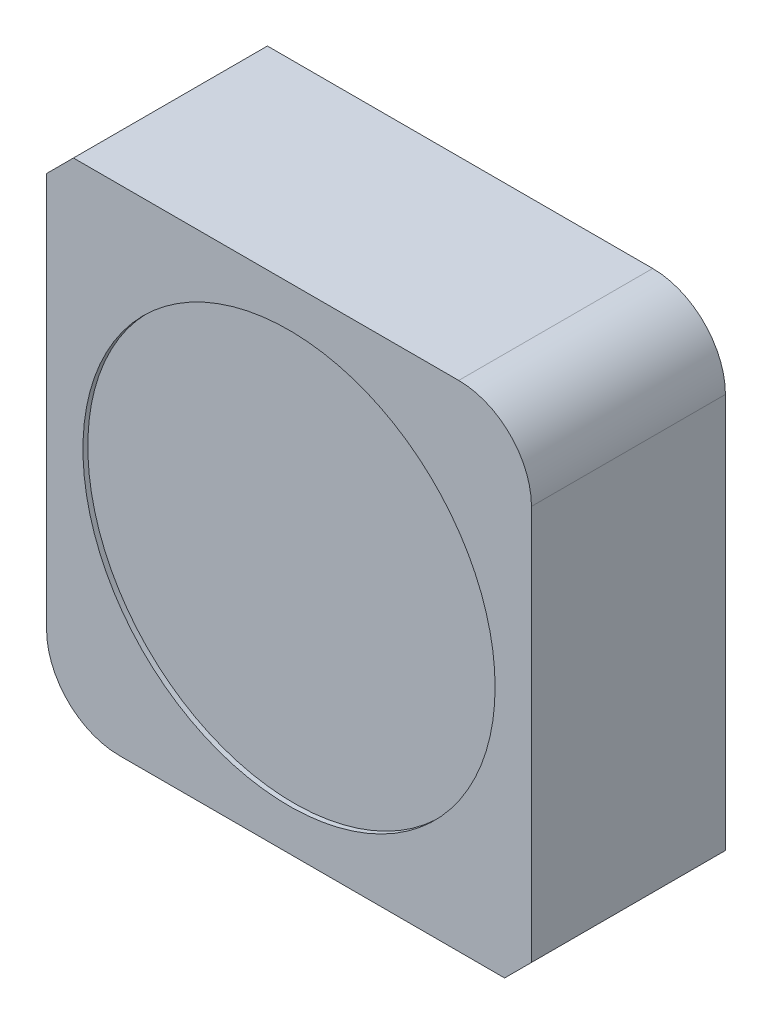
ISO-10303-21;
HEADER;
FILE_DESCRIPTION(('STEP AP214'),'2;1');
FILE_NAME('part.step','',(''),(''),'','','');
FILE_SCHEMA(('AUTOMOTIVE_DESIGN { 1 0 10303 214 1 1 1 1 }'));
ENDSEC;
DATA;
#1=APPLICATION_CONTEXT('core data for automotive mechanical design processes');
#2=APPLICATION_PROTOCOL_DEFINITION('international standard','automotive_design',2000,#1);
#3=PRODUCT_CONTEXT('',#1,'mechanical');
#4=PRODUCT('Part','Part','',(#3));
#5=PRODUCT_RELATED_PRODUCT_CATEGORY('part','',(#4));
#6=PRODUCT_DEFINITION_FORMATION('','',#4);
#7=PRODUCT_DEFINITION_CONTEXT('part definition',#1,'design');
#8=PRODUCT_DEFINITION('design','',#6,#7);
#9=PRODUCT_DEFINITION_SHAPE('','',#8);
#10=(LENGTH_UNIT() NAMED_UNIT(*) SI_UNIT(.MILLI.,.METRE.));
#11=(NAMED_UNIT(*) PLANE_ANGLE_UNIT() SI_UNIT($,.RADIAN.));
#12=(NAMED_UNIT(*) SI_UNIT($,.STERADIAN.) SOLID_ANGLE_UNIT());
#13=UNCERTAINTY_MEASURE_WITH_UNIT(LENGTH_MEASURE(1.E-05),#10,'distance_accuracy_value','');
#14=(GEOMETRIC_REPRESENTATION_CONTEXT(3) GLOBAL_UNCERTAINTY_ASSIGNED_CONTEXT((#13)) GLOBAL_UNIT_ASSIGNED_CONTEXT((#10,
#11,#12)) REPRESENTATION_CONTEXT('',''));
#15=CARTESIAN_POINT('',(0.,0.,0.));
#16=DIRECTION('',(0.,0.,1.));
#17=DIRECTION('',(1.,0.,0.));
#18=AXIS2_PLACEMENT_3D('',#15,#16,#17);
#19=CARTESIAN_POINT('',(-4.4459415460184,5.1,4.));
#20=DIRECTION('',(0.707106781186555,-0.70710678118654,0.));
#21=DIRECTION('',(0.70710678118654,0.707106781186555,0.));
#22=AXIS2_PLACEMENT_3D('',#19,#20,#21);
#23=PLANE('',#22);
#24=DIRECTION('',(-0.70710678118654,-0.707106781186555,0.));
#25=VECTOR('',#24,1.);
#26=CARTESIAN_POINT('',(-4.4459415460184,5.1,0.));
#27=LINE('',#26,#25);
#28=CARTESIAN_POINT('',(-4.4459415460184,5.1,0.));
#29=VERTEX_POINT('',#28);
#30=CARTESIAN_POINT('',(-5.,4.54594154601839,0.));
#31=VERTEX_POINT('',#30);
#32=EDGE_CURVE('E115',#29,#31,#27,.T.);
#33=ORIENTED_EDGE('',*,*,#32,.T.);
#34=DIRECTION('',(0.,0.,-1.));
#35=VECTOR('',#34,1.);
#36=CARTESIAN_POINT('',(-5.,4.54594154601839,4.));
#37=LINE('',#36,#35);
#38=CARTESIAN_POINT('',(-5.,4.54594154601839,4.));
#39=VERTEX_POINT('',#38);
#40=EDGE_CURVE('E99',#39,#31,#37,.T.);
#41=ORIENTED_EDGE('',*,*,#40,.F.);
#42=DIRECTION('',(-0.70710678118654,-0.707106781186555,0.));
#43=VECTOR('',#42,1.);
#44=CARTESIAN_POINT('',(-4.4459415460184,5.1,4.));
#45=LINE('',#44,#43);
#46=CARTESIAN_POINT('',(-4.4459415460184,5.1,4.));
#47=VERTEX_POINT('',#46);
#48=EDGE_CURVE('E102',#47,#39,#45,.T.);
#49=ORIENTED_EDGE('',*,*,#48,.F.);
#50=DIRECTION('',(0.,0.,-1.));
#51=VECTOR('',#50,1.);
#52=CARTESIAN_POINT('',(-4.4459415460184,5.1,4.));
#53=LINE('',#52,#51);
#54=EDGE_CURVE('E158',#47,#29,#53,.T.);
#55=ORIENTED_EDGE('',*,*,#54,.T.);
#56=EDGE_LOOP('',(#33,#41,#49,#55));
#57=FACE_BOUND('',#56,.T.);
#58=ADVANCED_FACE('F33',(#57),#23,.F.);
#59=CARTESIAN_POINT('',(-5.,4.54594154601839,4.));
#60=DIRECTION('',(1.,0.,0.));
#61=DIRECTION('',(0.,0.,-1.));
#62=AXIS2_PLACEMENT_3D('',#59,#60,#61);
#63=PLANE('',#62);
#64=DIRECTION('',(0.,-1.,0.));
#65=VECTOR('',#64,1.);
#66=CARTESIAN_POINT('',(-5.,4.54594154601839,0.));
#67=LINE('',#66,#65);
#68=CARTESIAN_POINT('',(-5.,-3.6,0.));
#69=VERTEX_POINT('',#68);
#70=EDGE_CURVE('E148',#31,#69,#67,.T.);
#71=ORIENTED_EDGE('',*,*,#70,.T.);
#72=DIRECTION('',(0.,0.,-1.));
#73=VECTOR('',#72,1.);
#74=CARTESIAN_POINT('',(-5.,-3.6,4.));
#75=LINE('',#74,#73);
#76=CARTESIAN_POINT('',(-5.,-3.6,4.));
#77=VERTEX_POINT('',#76);
#78=EDGE_CURVE('E11',#69,#77,#75,.F.);
#79=ORIENTED_EDGE('',*,*,#78,.T.);
#80=DIRECTION('',(0.,-1.,0.));
#81=VECTOR('',#80,1.);
#82=CARTESIAN_POINT('',(-5.,4.54594154601839,4.));
#83=LINE('',#82,#81);
#84=EDGE_CURVE('E95',#39,#77,#83,.T.);
#85=ORIENTED_EDGE('',*,*,#84,.F.);
#86=ORIENTED_EDGE('',*,*,#40,.T.);
#87=EDGE_LOOP('',(#71,#79,#85,#86));
#88=FACE_BOUND('',#87,.T.);
#89=ADVANCED_FACE('F97',(#88),#63,.F.);
#90=CARTESIAN_POINT('',(-5.,-5.1,4.));
#91=DIRECTION('',(0.,1.,0.));
#92=DIRECTION('',(-1.,0.,0.));
#93=AXIS2_PLACEMENT_3D('',#90,#91,#92);
#94=PLANE('',#93);
#95=DIRECTION('',(1.,0.,0.));
#96=VECTOR('',#95,1.);
#97=CARTESIAN_POINT('',(-5.,-5.1,4.));
#98=LINE('',#97,#96);
#99=CARTESIAN_POINT('',(-3.5,-5.1,4.));
#100=VERTEX_POINT('',#99);
#101=CARTESIAN_POINT('',(4.4459415460184,-5.1,4.));
#102=VERTEX_POINT('',#101);
#103=EDGE_CURVE('E101',#100,#102,#98,.T.);
#104=ORIENTED_EDGE('',*,*,#103,.F.);
#105=DIRECTION('',(0.,0.,-1.));
#106=VECTOR('',#105,1.);
#107=CARTESIAN_POINT('',(-3.5,-5.1,4.));
#108=LINE('',#107,#106);
#109=CARTESIAN_POINT('',(-3.5,-5.1,0.));
#110=VERTEX_POINT('',#109);
#111=EDGE_CURVE('E41',#100,#110,#108,.T.);
#112=ORIENTED_EDGE('',*,*,#111,.T.);
#113=DIRECTION('',(1.,0.,0.));
#114=VECTOR('',#113,1.);
#115=CARTESIAN_POINT('',(-5.,-5.1,0.));
#116=LINE('',#115,#114);
#117=CARTESIAN_POINT('',(4.4459415460184,-5.1,0.));
#118=VERTEX_POINT('',#117);
#119=EDGE_CURVE('E140',#110,#118,#116,.T.);
#120=ORIENTED_EDGE('',*,*,#119,.T.);
#121=DIRECTION('',(0.,0.,-1.));
#122=VECTOR('',#121,1.);
#123=CARTESIAN_POINT('',(4.4459415460184,-5.1,4.));
#124=LINE('',#123,#122);
#125=EDGE_CURVE('E117',#102,#118,#124,.T.);
#126=ORIENTED_EDGE('',*,*,#125,.F.);
#127=EDGE_LOOP('',(#104,#112,#120,#126));
#128=FACE_BOUND('',#127,.T.);
#129=ADVANCED_FACE('F138',(#128),#94,.F.);
#130=CARTESIAN_POINT('',(4.4459415460184,-5.1,4.));
#131=DIRECTION('',(-0.707106781186549,0.707106781186546,0.));
#132=DIRECTION('',(-0.707106781186546,-0.707106781186549,0.));
#133=AXIS2_PLACEMENT_3D('',#130,#131,#132);
#134=PLANE('',#133);
#135=DIRECTION('',(0.707106781186546,0.707106781186549,0.));
#136=VECTOR('',#135,1.);
#137=CARTESIAN_POINT('',(4.4459415460184,-5.1,0.));
#138=LINE('',#137,#136);
#139=CARTESIAN_POINT('',(5.,-4.5459415460184,0.));
#140=VERTEX_POINT('',#139);
#141=EDGE_CURVE('E147',#118,#140,#138,.T.);
#142=ORIENTED_EDGE('',*,*,#141,.T.);
#143=DIRECTION('',(0.,0.,-1.));
#144=VECTOR('',#143,1.);
#145=CARTESIAN_POINT('',(5.,-4.5459415460184,4.));
#146=LINE('',#145,#144);
#147=CARTESIAN_POINT('',(5.,-4.5459415460184,4.));
#148=VERTEX_POINT('',#147);
#149=EDGE_CURVE('E123',#148,#140,#146,.T.);
#150=ORIENTED_EDGE('',*,*,#149,.F.);
#151=DIRECTION('',(0.707106781186546,0.707106781186549,0.));
#152=VECTOR('',#151,1.);
#153=CARTESIAN_POINT('',(4.4459415460184,-5.1,4.));
#154=LINE('',#153,#152);
#155=EDGE_CURVE('E175',#102,#148,#154,.T.);
#156=ORIENTED_EDGE('',*,*,#155,.F.);
#157=ORIENTED_EDGE('',*,*,#125,.T.);
#158=EDGE_LOOP('',(#142,#150,#156,#157));
#159=FACE_BOUND('',#158,.T.);
#160=ADVANCED_FACE('F187',(#159),#134,.F.);
#161=CARTESIAN_POINT('',(5.,-4.5459415460184,4.));
#162=DIRECTION('',(-1.,0.,0.));
#163=DIRECTION('',(0.,0.,1.));
#164=AXIS2_PLACEMENT_3D('',#161,#162,#163);
#165=PLANE('',#164);
#166=DIRECTION('',(0.,1.,0.));
#167=VECTOR('',#166,1.);
#168=CARTESIAN_POINT('',(5.,-4.5459415460184,0.));
#169=LINE('',#168,#167);
#170=CARTESIAN_POINT('',(5.,3.6,0.));
#171=VERTEX_POINT('',#170);
#172=EDGE_CURVE('E150',#140,#171,#169,.T.);
#173=ORIENTED_EDGE('',*,*,#172,.T.);
#174=DIRECTION('',(0.,0.,-1.));
#175=VECTOR('',#174,1.);
#176=CARTESIAN_POINT('',(5.,3.6,4.));
#177=LINE('',#176,#175);
#178=CARTESIAN_POINT('',(5.,3.6,4.));
#179=VERTEX_POINT('',#178);
#180=EDGE_CURVE('E130',#171,#179,#177,.F.);
#181=ORIENTED_EDGE('',*,*,#180,.T.);
#182=DIRECTION('',(0.,1.,0.));
#183=VECTOR('',#182,1.);
#184=CARTESIAN_POINT('',(5.,-4.5459415460184,4.));
#185=LINE('',#184,#183);
#186=EDGE_CURVE('E165',#148,#179,#185,.T.);
#187=ORIENTED_EDGE('',*,*,#186,.F.);
#188=ORIENTED_EDGE('',*,*,#149,.T.);
#189=EDGE_LOOP('',(#173,#181,#187,#188));
#190=FACE_BOUND('',#189,.T.);
#191=ADVANCED_FACE('F163',(#190),#165,.F.);
#192=CARTESIAN_POINT('',(5.,5.1,4.));
#193=DIRECTION('',(0.,-1.,0.));
#194=DIRECTION('',(1.,0.,0.));
#195=AXIS2_PLACEMENT_3D('',#192,#193,#194);
#196=PLANE('',#195);
#197=DIRECTION('',(-1.,0.,0.));
#198=VECTOR('',#197,1.);
#199=CARTESIAN_POINT('',(5.,5.1,4.));
#200=LINE('',#199,#198);
#201=CARTESIAN_POINT('',(3.5,5.1,4.));
#202=VERTEX_POINT('',#201);
#203=EDGE_CURVE('E108',#202,#47,#200,.T.);
#204=ORIENTED_EDGE('',*,*,#203,.F.);
#205=DIRECTION('',(0.,0.,-1.));
#206=VECTOR('',#205,1.);
#207=CARTESIAN_POINT('',(3.5,5.1,4.));
#208=LINE('',#207,#206);
#209=CARTESIAN_POINT('',(3.5,5.1,0.));
#210=VERTEX_POINT('',#209);
#211=EDGE_CURVE('E116',#202,#210,#208,.T.);
#212=ORIENTED_EDGE('',*,*,#211,.T.);
#213=DIRECTION('',(-1.,0.,0.));
#214=VECTOR('',#213,1.);
#215=CARTESIAN_POINT('',(5.,5.1,0.));
#216=LINE('',#215,#214);
#217=EDGE_CURVE('E112',#210,#29,#216,.T.);
#218=ORIENTED_EDGE('',*,*,#217,.T.);
#219=ORIENTED_EDGE('',*,*,#54,.F.);
#220=EDGE_LOOP('',(#204,#212,#218,#219));
#221=FACE_BOUND('',#220,.T.);
#222=ADVANCED_FACE('F173',(#221),#196,.F.);
#223=CARTESIAN_POINT('',(0.,0.,4.));
#224=DIRECTION('',(0.,0.,1.));
#225=DIRECTION('',(1.,0.,0.));
#226=AXIS2_PLACEMENT_3D('',#223,#224,#225);
#227=PLANE('',#226);
#228=CARTESIAN_POINT('',(0.,0.,4.));
#229=DIRECTION('',(0.,0.,1.));
#230=DIRECTION('',(1.,0.,0.));
#231=AXIS2_PLACEMENT_3D('',#228,#229,#230);
#232=CIRCLE('',#231,4.25);
#233=CARTESIAN_POINT('',(4.25,0.,4.));
#234=VERTEX_POINT('',#233);
#235=EDGE_CURVE('E180',#234,#234,#232,.T.);
#236=ORIENTED_EDGE('',*,*,#235,.F.);
#237=EDGE_LOOP('',(#236));
#238=FACE_BOUND('',#237,.T.);
#239=ORIENTED_EDGE('',*,*,#186,.T.);
#240=CARTESIAN_POINT('',(3.5,3.6,4.));
#241=DIRECTION('',(0.,0.,1.));
#242=DIRECTION('',(1.,0.,0.));
#243=AXIS2_PLACEMENT_3D('',#240,#241,#242);
#244=CIRCLE('',#243,1.5);
#245=EDGE_CURVE('E133',#179,#202,#244,.T.);
#246=ORIENTED_EDGE('',*,*,#245,.T.);
#247=ORIENTED_EDGE('',*,*,#203,.T.);
#248=ORIENTED_EDGE('',*,*,#48,.T.);
#249=ORIENTED_EDGE('',*,*,#84,.T.);
#250=CARTESIAN_POINT('',(-3.5,-3.6,4.));
#251=DIRECTION('',(0.,0.,1.));
#252=DIRECTION('',(1.,0.,0.));
#253=AXIS2_PLACEMENT_3D('',#250,#251,#252);
#254=CIRCLE('',#253,1.5);
#255=EDGE_CURVE('E48',#77,#100,#254,.T.);
#256=ORIENTED_EDGE('',*,*,#255,.T.);
#257=ORIENTED_EDGE('',*,*,#103,.T.);
#258=ORIENTED_EDGE('',*,*,#155,.T.);
#259=EDGE_LOOP('',(#239,#246,#247,#248,#249,#256,#257,#258));
#260=FACE_BOUND('',#259,.T.);
#261=ADVANCED_FACE('F106',(#238,#260),#227,.T.);
#262=CARTESIAN_POINT('',(0.,0.,0.));
#263=DIRECTION('',(0.,0.,1.));
#264=DIRECTION('',(1.,0.,0.));
#265=AXIS2_PLACEMENT_3D('',#262,#263,#264);
#266=PLANE('',#265);
#267=ORIENTED_EDGE('',*,*,#217,.F.);
#268=CARTESIAN_POINT('',(3.5,3.6,0.));
#269=DIRECTION('',(0.,0.,1.));
#270=DIRECTION('',(1.,0.,0.));
#271=AXIS2_PLACEMENT_3D('',#268,#269,#270);
#272=CIRCLE('',#271,1.5);
#273=EDGE_CURVE('E128',#210,#171,#272,.F.);
#274=ORIENTED_EDGE('',*,*,#273,.T.);
#275=ORIENTED_EDGE('',*,*,#172,.F.);
#276=ORIENTED_EDGE('',*,*,#141,.F.);
#277=ORIENTED_EDGE('',*,*,#119,.F.);
#278=CARTESIAN_POINT('',(-3.5,-3.6,0.));
#279=DIRECTION('',(0.,0.,1.));
#280=DIRECTION('',(1.,0.,0.));
#281=AXIS2_PLACEMENT_3D('',#278,#279,#280);
#282=CIRCLE('',#281,1.5);
#283=EDGE_CURVE('E120',#110,#69,#282,.F.);
#284=ORIENTED_EDGE('',*,*,#283,.T.);
#285=ORIENTED_EDGE('',*,*,#70,.F.);
#286=ORIENTED_EDGE('',*,*,#32,.F.);
#287=EDGE_LOOP('',(#267,#274,#275,#276,#277,#284,#285,#286));
#288=FACE_BOUND('',#287,.T.);
#289=ADVANCED_FACE('F145',(#288),#266,.F.);
#290=CARTESIAN_POINT('',(3.5,3.6,4.));
#291=DIRECTION('',(0.,0.,-1.));
#292=DIRECTION('',(-1.,0.,0.));
#293=AXIS2_PLACEMENT_3D('',#290,#291,#292);
#294=CYLINDRICAL_SURFACE('',#293,1.5);
#295=ORIENTED_EDGE('',*,*,#245,.F.);
#296=ORIENTED_EDGE('',*,*,#180,.F.);
#297=ORIENTED_EDGE('',*,*,#273,.F.);
#298=ORIENTED_EDGE('',*,*,#211,.F.);
#299=EDGE_LOOP('',(#295,#296,#297,#298));
#300=FACE_BOUND('',#299,.T.);
#301=ADVANCED_FACE('F171',(#300),#294,.T.);
#302=CARTESIAN_POINT('',(-3.5,-3.6,4.));
#303=DIRECTION('',(0.,0.,-1.));
#304=DIRECTION('',(-1.,0.,0.));
#305=AXIS2_PLACEMENT_3D('',#302,#303,#304);
#306=CYLINDRICAL_SURFACE('',#305,1.5);
#307=ORIENTED_EDGE('',*,*,#255,.F.);
#308=ORIENTED_EDGE('',*,*,#78,.F.);
#309=ORIENTED_EDGE('',*,*,#283,.F.);
#310=ORIENTED_EDGE('',*,*,#111,.F.);
#311=EDGE_LOOP('',(#307,#308,#309,#310));
#312=FACE_BOUND('',#311,.T.);
#313=ADVANCED_FACE('F35',(#312),#306,.T.);
#314=CARTESIAN_POINT('',(0.,0.,3.9));
#315=DIRECTION('',(0.,0.,1.));
#316=DIRECTION('',(1.,0.,0.));
#317=AXIS2_PLACEMENT_3D('',#314,#315,#316);
#318=CYLINDRICAL_SURFACE('',#317,4.25);
#319=CARTESIAN_POINT('',(0.,0.,3.9));
#320=DIRECTION('',(0.,0.,1.));
#321=DIRECTION('',(1.,0.,0.));
#322=AXIS2_PLACEMENT_3D('',#319,#320,#321);
#323=CIRCLE('',#322,4.25);
#324=CARTESIAN_POINT('',(4.25,0.,3.9));
#325=VERTEX_POINT('',#324);
#326=EDGE_CURVE('E178',#325,#325,#323,.T.);
#327=ORIENTED_EDGE('',*,*,#326,.F.);
#328=EDGE_LOOP('',(#327));
#329=FACE_BOUND('',#328,.T.);
#330=ORIENTED_EDGE('',*,*,#235,.T.);
#331=EDGE_LOOP('',(#330));
#332=FACE_BOUND('',#331,.T.);
#333=ADVANCED_FACE('F207',(#329,#332),#318,.F.);
#334=CARTESIAN_POINT('',(0.,0.,3.9));
#335=DIRECTION('',(0.,0.,1.));
#336=DIRECTION('',(1.,0.,0.));
#337=AXIS2_PLACEMENT_3D('',#334,#335,#336);
#338=PLANE('',#337);
#339=ORIENTED_EDGE('',*,*,#326,.T.);
#340=EDGE_LOOP('',(#339));
#341=FACE_BOUND('',#340,.T.);
#342=ADVANCED_FACE('F238',(#341),#338,.T.);
#343=CLOSED_SHELL('',(#58,#89,#129,#160,#191,#222,#261,#289,#301,#313,#333,#342));
#344=MANIFOLD_SOLID_BREP('B2',#343);
#345=ADVANCED_BREP_SHAPE_REPRESENTATION('',(#18,#344),#14);
#346=SHAPE_DEFINITION_REPRESENTATION(#9,#345);
ENDSEC;
END-ISO-10303-21;
